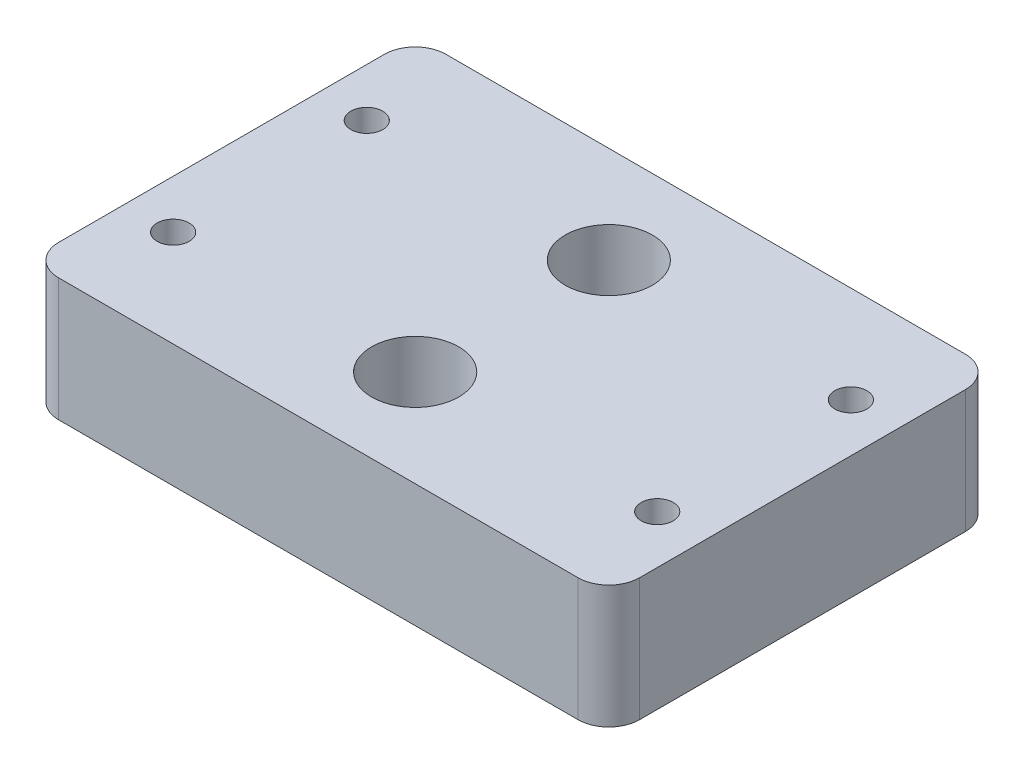
ISO-10303-21;
HEADER;
FILE_DESCRIPTION(('STEP AP214'),'2;1');
FILE_NAME('part.step','',(''),(''),'','','');
FILE_SCHEMA(('AUTOMOTIVE_DESIGN { 1 0 10303 214 1 1 1 1 }'));
ENDSEC;
DATA;
#1=APPLICATION_CONTEXT('core data for automotive mechanical design processes');
#2=APPLICATION_PROTOCOL_DEFINITION('international standard','automotive_design',2000,#1);
#3=PRODUCT_CONTEXT('',#1,'mechanical');
#4=PRODUCT('Part','Part','',(#3));
#5=PRODUCT_RELATED_PRODUCT_CATEGORY('part','',(#4));
#6=PRODUCT_DEFINITION_FORMATION('','',#4);
#7=PRODUCT_DEFINITION_CONTEXT('part definition',#1,'design');
#8=PRODUCT_DEFINITION('design','',#6,#7);
#9=PRODUCT_DEFINITION_SHAPE('','',#8);
#10=(LENGTH_UNIT() NAMED_UNIT(*) SI_UNIT(.MILLI.,.METRE.));
#11=(NAMED_UNIT(*) PLANE_ANGLE_UNIT() SI_UNIT($,.RADIAN.));
#12=(NAMED_UNIT(*) SI_UNIT($,.STERADIAN.) SOLID_ANGLE_UNIT());
#13=UNCERTAINTY_MEASURE_WITH_UNIT(LENGTH_MEASURE(1.E-05),#10,'distance_accuracy_value','');
#14=(GEOMETRIC_REPRESENTATION_CONTEXT(3) GLOBAL_UNCERTAINTY_ASSIGNED_CONTEXT((#13)) GLOBAL_UNIT_ASSIGNED_CONTEXT((#10,
#11,#12)) REPRESENTATION_CONTEXT('',''));
#15=CARTESIAN_POINT('',(0.,0.,0.));
#16=DIRECTION('',(0.,0.,1.));
#17=DIRECTION('',(1.,0.,0.));
#18=AXIS2_PLACEMENT_3D('',#15,#16,#17);
#19=CARTESIAN_POINT('',(60.,12.7,0.));
#20=DIRECTION('',(1.,0.,0.));
#21=DIRECTION('',(0.,0.,-1.));
#22=AXIS2_PLACEMENT_3D('',#19,#20,#21);
#23=PLANE('',#22);
#24=DIRECTION('',(0.,0.,1.));
#25=VECTOR('',#24,1.);
#26=CARTESIAN_POINT('',(60.,12.7,0.));
#27=LINE('',#26,#25);
#28=CARTESIAN_POINT('',(60.,12.7,3.175));
#29=VERTEX_POINT('',#28);
#30=CARTESIAN_POINT('',(60.,12.7,36.825));
#31=VERTEX_POINT('',#30);
#32=EDGE_CURVE('E195',#29,#31,#27,.T.);
#33=ORIENTED_EDGE('',*,*,#32,.T.);
#34=DIRECTION('',(0.,-1.,0.));
#35=VECTOR('',#34,1.);
#36=CARTESIAN_POINT('',(60.,0.,36.825));
#37=LINE('',#36,#35);
#38=CARTESIAN_POINT('',(60.,0.,36.825));
#39=VERTEX_POINT('',#38);
#40=EDGE_CURVE('E182',#31,#39,#37,.T.);
#41=ORIENTED_EDGE('',*,*,#40,.T.);
#42=DIRECTION('',(0.,0.,1.));
#43=VECTOR('',#42,1.);
#44=CARTESIAN_POINT('',(60.,0.,0.));
#45=LINE('',#44,#43);
#46=CARTESIAN_POINT('',(60.,0.,3.175));
#47=VERTEX_POINT('',#46);
#48=EDGE_CURVE('E245',#47,#39,#45,.T.);
#49=ORIENTED_EDGE('',*,*,#48,.F.);
#50=DIRECTION('',(0.,-1.,0.));
#51=VECTOR('',#50,1.);
#52=CARTESIAN_POINT('',(60.,12.7,3.175));
#53=LINE('',#52,#51);
#54=EDGE_CURVE('E179',#47,#29,#53,.F.);
#55=ORIENTED_EDGE('',*,*,#54,.T.);
#56=EDGE_LOOP('',(#33,#41,#49,#55));
#57=FACE_BOUND('',#56,.T.);
#58=ADVANCED_FACE('F46',(#57),#23,.T.);
#59=CARTESIAN_POINT('',(0.,12.7,0.));
#60=DIRECTION('',(0.,0.,-1.));
#61=DIRECTION('',(-1.,0.,0.));
#62=AXIS2_PLACEMENT_3D('',#59,#60,#61);
#63=PLANE('',#62);
#64=DIRECTION('',(1.,0.,0.));
#65=VECTOR('',#64,1.);
#66=CARTESIAN_POINT('',(0.,12.7,0.));
#67=LINE('',#66,#65);
#68=CARTESIAN_POINT('',(3.175,12.7,0.));
#69=VERTEX_POINT('',#68);
#70=CARTESIAN_POINT('',(56.825,12.7,0.));
#71=VERTEX_POINT('',#70);
#72=EDGE_CURVE('E192',#69,#71,#67,.T.);
#73=ORIENTED_EDGE('',*,*,#72,.T.);
#74=DIRECTION('',(0.,-1.,0.));
#75=VECTOR('',#74,1.);
#76=CARTESIAN_POINT('',(56.825,12.7,0.));
#77=LINE('',#76,#75);
#78=CARTESIAN_POINT('',(56.825,0.,0.));
#79=VERTEX_POINT('',#78);
#80=EDGE_CURVE('E11',#71,#79,#77,.T.);
#81=ORIENTED_EDGE('',*,*,#80,.T.);
#82=DIRECTION('',(1.,0.,0.));
#83=VECTOR('',#82,1.);
#84=CARTESIAN_POINT('',(0.,0.,0.));
#85=LINE('',#84,#83);
#86=CARTESIAN_POINT('',(3.175,0.,0.));
#87=VERTEX_POINT('',#86);
#88=EDGE_CURVE('E150',#87,#79,#85,.T.);
#89=ORIENTED_EDGE('',*,*,#88,.F.);
#90=DIRECTION('',(0.,-1.,0.));
#91=VECTOR('',#90,1.);
#92=CARTESIAN_POINT('',(3.175,12.7,0.));
#93=LINE('',#92,#91);
#94=EDGE_CURVE('E55',#87,#69,#93,.F.);
#95=ORIENTED_EDGE('',*,*,#94,.T.);
#96=EDGE_LOOP('',(#73,#81,#89,#95));
#97=FACE_BOUND('',#96,.T.);
#98=ADVANCED_FACE('F250',(#97),#63,.T.);
#99=CARTESIAN_POINT('',(0.,12.7,0.));
#100=DIRECTION('',(1.,0.,0.));
#101=DIRECTION('',(0.,0.,-1.));
#102=AXIS2_PLACEMENT_3D('',#99,#100,#101);
#103=PLANE('',#102);
#104=DIRECTION('',(0.,0.,1.));
#105=VECTOR('',#104,1.);
#106=CARTESIAN_POINT('',(0.,0.,0.));
#107=LINE('',#106,#105);
#108=CARTESIAN_POINT('',(0.,0.,3.175));
#109=VERTEX_POINT('',#108);
#110=CARTESIAN_POINT('',(0.,0.,36.825));
#111=VERTEX_POINT('',#110);
#112=EDGE_CURVE('E143',#109,#111,#107,.T.);
#113=ORIENTED_EDGE('',*,*,#112,.T.);
#114=DIRECTION('',(0.,-1.,0.));
#115=VECTOR('',#114,1.);
#116=CARTESIAN_POINT('',(0.,12.7,36.825));
#117=LINE('',#116,#115);
#118=CARTESIAN_POINT('',(0.,12.7,36.825));
#119=VERTEX_POINT('',#118);
#120=EDGE_CURVE('E118',#111,#119,#117,.F.);
#121=ORIENTED_EDGE('',*,*,#120,.T.);
#122=DIRECTION('',(0.,0.,1.));
#123=VECTOR('',#122,1.);
#124=CARTESIAN_POINT('',(0.,12.7,0.));
#125=LINE('',#124,#123);
#126=CARTESIAN_POINT('',(0.,12.7,3.175));
#127=VERTEX_POINT('',#126);
#128=EDGE_CURVE('E188',#127,#119,#125,.T.);
#129=ORIENTED_EDGE('',*,*,#128,.F.);
#130=DIRECTION('',(0.,-1.,0.));
#131=VECTOR('',#130,1.);
#132=CARTESIAN_POINT('',(0.,0.,3.175));
#133=LINE('',#132,#131);
#134=EDGE_CURVE('E124',#127,#109,#133,.T.);
#135=ORIENTED_EDGE('',*,*,#134,.T.);
#136=EDGE_LOOP('',(#113,#121,#129,#135));
#137=FACE_BOUND('',#136,.T.);
#138=ADVANCED_FACE('F258',(#137),#103,.F.);
#139=CARTESIAN_POINT('',(30.,12.7,30.));
#140=DIRECTION('',(0.,-1.,0.));
#141=DIRECTION('',(0.,0.,-1.));
#142=AXIS2_PLACEMENT_3D('',#139,#140,#141);
#143=CYLINDRICAL_SURFACE('',#142,4.50000000000002);
#144=CARTESIAN_POINT('',(30.,12.7,30.));
#145=DIRECTION('',(0.,1.,0.));
#146=DIRECTION('',(0.,0.,1.));
#147=AXIS2_PLACEMENT_3D('',#144,#145,#146);
#148=CIRCLE('',#147,4.50000000000002);
#149=CARTESIAN_POINT('',(30.,12.7,34.5));
#150=VERTEX_POINT('',#149);
#151=EDGE_CURVE('E199',#150,#150,#148,.T.);
#152=ORIENTED_EDGE('',*,*,#151,.T.);
#153=EDGE_LOOP('',(#152));
#154=FACE_BOUND('',#153,.T.);
#155=CARTESIAN_POINT('',(30.,0.,30.));
#156=DIRECTION('',(0.,1.,0.));
#157=DIRECTION('',(0.,0.,1.));
#158=AXIS2_PLACEMENT_3D('',#155,#156,#157);
#159=CIRCLE('',#158,4.50000000000002);
#160=CARTESIAN_POINT('',(30.,0.,34.5));
#161=VERTEX_POINT('',#160);
#162=EDGE_CURVE('E241',#161,#161,#159,.T.);
#163=ORIENTED_EDGE('',*,*,#162,.F.);
#164=EDGE_LOOP('',(#163));
#165=FACE_BOUND('',#164,.T.);
#166=ADVANCED_FACE('F260',(#154,#165),#143,.F.);
#167=CARTESIAN_POINT('',(30.,12.7,10.));
#168=DIRECTION('',(0.,-1.,0.));
#169=DIRECTION('',(0.,0.,-1.));
#170=AXIS2_PLACEMENT_3D('',#167,#168,#169);
#171=CYLINDRICAL_SURFACE('',#170,4.50000000000007);
#172=CARTESIAN_POINT('',(30.,12.7,10.));
#173=DIRECTION('',(0.,1.,0.));
#174=DIRECTION('',(0.,0.,1.));
#175=AXIS2_PLACEMENT_3D('',#172,#173,#174);
#176=CIRCLE('',#175,4.50000000000007);
#177=CARTESIAN_POINT('',(30.,12.7,14.5000000000001));
#178=VERTEX_POINT('',#177);
#179=EDGE_CURVE('E203',#178,#178,#176,.T.);
#180=ORIENTED_EDGE('',*,*,#179,.T.);
#181=EDGE_LOOP('',(#180));
#182=FACE_BOUND('',#181,.T.);
#183=CARTESIAN_POINT('',(30.,0.,10.));
#184=DIRECTION('',(0.,1.,0.));
#185=DIRECTION('',(0.,0.,1.));
#186=AXIS2_PLACEMENT_3D('',#183,#184,#185);
#187=CIRCLE('',#186,4.50000000000007);
#188=CARTESIAN_POINT('',(30.,0.,14.5000000000001));
#189=VERTEX_POINT('',#188);
#190=EDGE_CURVE('E237',#189,#189,#187,.T.);
#191=ORIENTED_EDGE('',*,*,#190,.F.);
#192=EDGE_LOOP('',(#191));
#193=FACE_BOUND('',#192,.T.);
#194=ADVANCED_FACE('F267',(#182,#193),#171,.F.);
#195=CARTESIAN_POINT('',(5.,12.7,10.));
#196=DIRECTION('',(0.,-1.,0.));
#197=DIRECTION('',(0.,0.,-1.));
#198=AXIS2_PLACEMENT_3D('',#195,#196,#197);
#199=CYLINDRICAL_SURFACE('',#198,1.651);
#200=CARTESIAN_POINT('',(5.,12.7,10.));
#201=DIRECTION('',(0.,1.,0.));
#202=DIRECTION('',(0.,0.,1.));
#203=AXIS2_PLACEMENT_3D('',#200,#201,#202);
#204=CIRCLE('',#203,1.651);
#205=CARTESIAN_POINT('',(5.,12.7,11.651));
#206=VERTEX_POINT('',#205);
#207=EDGE_CURVE('E207',#206,#206,#204,.T.);
#208=ORIENTED_EDGE('',*,*,#207,.T.);
#209=EDGE_LOOP('',(#208));
#210=FACE_BOUND('',#209,.T.);
#211=CARTESIAN_POINT('',(5.,0.,10.));
#212=DIRECTION('',(0.,1.,0.));
#213=DIRECTION('',(0.,0.,1.));
#214=AXIS2_PLACEMENT_3D('',#211,#212,#213);
#215=CIRCLE('',#214,1.651);
#216=CARTESIAN_POINT('',(5.,0.,11.651));
#217=VERTEX_POINT('',#216);
#218=EDGE_CURVE('E233',#217,#217,#215,.T.);
#219=ORIENTED_EDGE('',*,*,#218,.F.);
#220=EDGE_LOOP('',(#219));
#221=FACE_BOUND('',#220,.T.);
#222=ADVANCED_FACE('F281',(#210,#221),#199,.F.);
#223=CARTESIAN_POINT('',(55.,12.7,10.));
#224=DIRECTION('',(0.,-1.,0.));
#225=DIRECTION('',(0.,0.,-1.));
#226=AXIS2_PLACEMENT_3D('',#223,#224,#225);
#227=CYLINDRICAL_SURFACE('',#226,1.651);
#228=CARTESIAN_POINT('',(55.,12.7,10.));
#229=DIRECTION('',(0.,1.,0.));
#230=DIRECTION('',(0.,0.,1.));
#231=AXIS2_PLACEMENT_3D('',#228,#229,#230);
#232=CIRCLE('',#231,1.651);
#233=CARTESIAN_POINT('',(55.,12.7,11.651));
#234=VERTEX_POINT('',#233);
#235=EDGE_CURVE('E211',#234,#234,#232,.T.);
#236=ORIENTED_EDGE('',*,*,#235,.T.);
#237=EDGE_LOOP('',(#236));
#238=FACE_BOUND('',#237,.T.);
#239=CARTESIAN_POINT('',(55.,0.,10.));
#240=DIRECTION('',(0.,1.,0.));
#241=DIRECTION('',(0.,0.,1.));
#242=AXIS2_PLACEMENT_3D('',#239,#240,#241);
#243=CIRCLE('',#242,1.651);
#244=CARTESIAN_POINT('',(55.,0.,11.651));
#245=VERTEX_POINT('',#244);
#246=EDGE_CURVE('E229',#245,#245,#243,.T.);
#247=ORIENTED_EDGE('',*,*,#246,.F.);
#248=EDGE_LOOP('',(#247));
#249=FACE_BOUND('',#248,.T.);
#250=ADVANCED_FACE('F285',(#238,#249),#227,.F.);
#251=CARTESIAN_POINT('',(5.,12.7,30.));
#252=DIRECTION('',(0.,-1.,0.));
#253=DIRECTION('',(0.,0.,-1.));
#254=AXIS2_PLACEMENT_3D('',#251,#252,#253);
#255=CYLINDRICAL_SURFACE('',#254,1.651);
#256=CARTESIAN_POINT('',(5.,12.7,30.));
#257=DIRECTION('',(0.,1.,0.));
#258=DIRECTION('',(0.,0.,1.));
#259=AXIS2_PLACEMENT_3D('',#256,#257,#258);
#260=CIRCLE('',#259,1.651);
#261=CARTESIAN_POINT('',(5.,12.7,31.651));
#262=VERTEX_POINT('',#261);
#263=EDGE_CURVE('E148',#262,#262,#260,.T.);
#264=ORIENTED_EDGE('',*,*,#263,.T.);
#265=EDGE_LOOP('',(#264));
#266=FACE_BOUND('',#265,.T.);
#267=CARTESIAN_POINT('',(5.,0.,30.));
#268=DIRECTION('',(0.,1.,0.));
#269=DIRECTION('',(0.,0.,1.));
#270=AXIS2_PLACEMENT_3D('',#267,#268,#269);
#271=CIRCLE('',#270,1.651);
#272=CARTESIAN_POINT('',(5.,0.,31.651));
#273=VERTEX_POINT('',#272);
#274=EDGE_CURVE('E225',#273,#273,#271,.T.);
#275=ORIENTED_EDGE('',*,*,#274,.F.);
#276=EDGE_LOOP('',(#275));
#277=FACE_BOUND('',#276,.T.);
#278=ADVANCED_FACE('F289',(#266,#277),#255,.F.);
#279=CARTESIAN_POINT('',(55.,12.7,30.));
#280=DIRECTION('',(0.,-1.,0.));
#281=DIRECTION('',(0.,0.,-1.));
#282=AXIS2_PLACEMENT_3D('',#279,#280,#281);
#283=CYLINDRICAL_SURFACE('',#282,1.651);
#284=CARTESIAN_POINT('',(55.,12.7,30.));
#285=DIRECTION('',(0.,1.,0.));
#286=DIRECTION('',(0.,0.,1.));
#287=AXIS2_PLACEMENT_3D('',#284,#285,#286);
#288=CIRCLE('',#287,1.651);
#289=CARTESIAN_POINT('',(55.,12.7,31.651));
#290=VERTEX_POINT('',#289);
#291=EDGE_CURVE('E142',#290,#290,#288,.T.);
#292=ORIENTED_EDGE('',*,*,#291,.T.);
#293=EDGE_LOOP('',(#292));
#294=FACE_BOUND('',#293,.T.);
#295=CARTESIAN_POINT('',(55.,0.,30.));
#296=DIRECTION('',(0.,1.,0.));
#297=DIRECTION('',(0.,0.,1.));
#298=AXIS2_PLACEMENT_3D('',#295,#296,#297);
#299=CIRCLE('',#298,1.651);
#300=CARTESIAN_POINT('',(55.,0.,31.651));
#301=VERTEX_POINT('',#300);
#302=EDGE_CURVE('E221',#301,#301,#299,.T.);
#303=ORIENTED_EDGE('',*,*,#302,.F.);
#304=EDGE_LOOP('',(#303));
#305=FACE_BOUND('',#304,.T.);
#306=ADVANCED_FACE('F293',(#294,#305),#283,.F.);
#307=CARTESIAN_POINT('',(0.,12.7,40.));
#308=DIRECTION('',(0.,0.,-1.));
#309=DIRECTION('',(-1.,0.,0.));
#310=AXIS2_PLACEMENT_3D('',#307,#308,#309);
#311=PLANE('',#310);
#312=DIRECTION('',(1.,0.,0.));
#313=VECTOR('',#312,1.);
#314=CARTESIAN_POINT('',(0.,12.7,40.));
#315=LINE('',#314,#313);
#316=CARTESIAN_POINT('',(3.175,12.7,40.));
#317=VERTEX_POINT('',#316);
#318=CARTESIAN_POINT('',(56.825,12.7,40.));
#319=VERTEX_POINT('',#318);
#320=EDGE_CURVE('E134',#317,#319,#315,.T.);
#321=ORIENTED_EDGE('',*,*,#320,.F.);
#322=DIRECTION('',(0.,-1.,0.));
#323=VECTOR('',#322,1.);
#324=CARTESIAN_POINT('',(3.175,12.7,40.));
#325=LINE('',#324,#323);
#326=CARTESIAN_POINT('',(3.175,0.,40.));
#327=VERTEX_POINT('',#326);
#328=EDGE_CURVE('E117',#317,#327,#325,.T.);
#329=ORIENTED_EDGE('',*,*,#328,.T.);
#330=DIRECTION('',(1.,0.,0.));
#331=VECTOR('',#330,1.);
#332=CARTESIAN_POINT('',(0.,0.,40.));
#333=LINE('',#332,#331);
#334=CARTESIAN_POINT('',(56.825,0.,40.));
#335=VERTEX_POINT('',#334);
#336=EDGE_CURVE('E131',#327,#335,#333,.T.);
#337=ORIENTED_EDGE('',*,*,#336,.T.);
#338=DIRECTION('',(0.,-1.,0.));
#339=VECTOR('',#338,1.);
#340=CARTESIAN_POINT('',(56.825,12.7,40.));
#341=LINE('',#340,#339);
#342=EDGE_CURVE('E137',#335,#319,#341,.F.);
#343=ORIENTED_EDGE('',*,*,#342,.T.);
#344=EDGE_LOOP('',(#321,#329,#337,#343));
#345=FACE_BOUND('',#344,.T.);
#346=ADVANCED_FACE('F130',(#345),#311,.F.);
#347=CARTESIAN_POINT('',(0.,12.7,0.));
#348=DIRECTION('',(0.,1.,0.));
#349=DIRECTION('',(0.,0.,1.));
#350=AXIS2_PLACEMENT_3D('',#347,#348,#349);
#351=PLANE('',#350);
#352=ORIENTED_EDGE('',*,*,#291,.F.);
#353=EDGE_LOOP('',(#352));
#354=FACE_BOUND('',#353,.T.);
#355=ORIENTED_EDGE('',*,*,#263,.F.);
#356=EDGE_LOOP('',(#355));
#357=FACE_BOUND('',#356,.T.);
#358=ORIENTED_EDGE('',*,*,#235,.F.);
#359=EDGE_LOOP('',(#358));
#360=FACE_BOUND('',#359,.T.);
#361=ORIENTED_EDGE('',*,*,#207,.F.);
#362=EDGE_LOOP('',(#361));
#363=FACE_BOUND('',#362,.T.);
#364=ORIENTED_EDGE('',*,*,#179,.F.);
#365=EDGE_LOOP('',(#364));
#366=FACE_BOUND('',#365,.T.);
#367=ORIENTED_EDGE('',*,*,#151,.F.);
#368=EDGE_LOOP('',(#367));
#369=FACE_BOUND('',#368,.T.);
#370=ORIENTED_EDGE('',*,*,#128,.T.);
#371=CARTESIAN_POINT('',(3.175,12.7,36.825));
#372=DIRECTION('',(0.,1.,0.));
#373=DIRECTION('',(0.,0.,1.));
#374=AXIS2_PLACEMENT_3D('',#371,#372,#373);
#375=CIRCLE('',#374,3.175);
#376=EDGE_CURVE('E176',#119,#317,#375,.T.);
#377=ORIENTED_EDGE('',*,*,#376,.T.);
#378=ORIENTED_EDGE('',*,*,#320,.T.);
#379=CARTESIAN_POINT('',(56.825,12.7,36.825));
#380=DIRECTION('',(0.,1.,0.));
#381=DIRECTION('',(0.,0.,1.));
#382=AXIS2_PLACEMENT_3D('',#379,#380,#381);
#383=CIRCLE('',#382,3.175);
#384=EDGE_CURVE('E173',#319,#31,#383,.T.);
#385=ORIENTED_EDGE('',*,*,#384,.T.);
#386=ORIENTED_EDGE('',*,*,#32,.F.);
#387=CARTESIAN_POINT('',(56.825,12.7,3.175));
#388=DIRECTION('',(0.,1.,0.));
#389=DIRECTION('',(0.,0.,1.));
#390=AXIS2_PLACEMENT_3D('',#387,#388,#389);
#391=CIRCLE('',#390,3.175);
#392=EDGE_CURVE('E62',#29,#71,#391,.T.);
#393=ORIENTED_EDGE('',*,*,#392,.T.);
#394=ORIENTED_EDGE('',*,*,#72,.F.);
#395=CARTESIAN_POINT('',(3.175,12.7,3.175));
#396=DIRECTION('',(0.,1.,0.));
#397=DIRECTION('',(0.,0.,1.));
#398=AXIS2_PLACEMENT_3D('',#395,#396,#397);
#399=CIRCLE('',#398,3.175);
#400=EDGE_CURVE('E168',#69,#127,#399,.T.);
#401=ORIENTED_EDGE('',*,*,#400,.T.);
#402=EDGE_LOOP('',(#370,#377,#378,#385,#386,#393,#394,#401));
#403=FACE_BOUND('',#402,.T.);
#404=ADVANCED_FACE('F256',(#354,#357,#360,#363,#366,#369,#403),#351,.T.);
#405=CARTESIAN_POINT('',(0.,0.,0.));
#406=DIRECTION('',(0.,1.,0.));
#407=DIRECTION('',(0.,0.,1.));
#408=AXIS2_PLACEMENT_3D('',#405,#406,#407);
#409=PLANE('',#408);
#410=ORIENTED_EDGE('',*,*,#302,.T.);
#411=EDGE_LOOP('',(#410));
#412=FACE_BOUND('',#411,.T.);
#413=ORIENTED_EDGE('',*,*,#274,.T.);
#414=EDGE_LOOP('',(#413));
#415=FACE_BOUND('',#414,.T.);
#416=ORIENTED_EDGE('',*,*,#246,.T.);
#417=EDGE_LOOP('',(#416));
#418=FACE_BOUND('',#417,.T.);
#419=ORIENTED_EDGE('',*,*,#218,.T.);
#420=EDGE_LOOP('',(#419));
#421=FACE_BOUND('',#420,.T.);
#422=ORIENTED_EDGE('',*,*,#190,.T.);
#423=EDGE_LOOP('',(#422));
#424=FACE_BOUND('',#423,.T.);
#425=ORIENTED_EDGE('',*,*,#162,.T.);
#426=EDGE_LOOP('',(#425));
#427=FACE_BOUND('',#426,.T.);
#428=ORIENTED_EDGE('',*,*,#336,.F.);
#429=CARTESIAN_POINT('',(3.175,0.,36.825));
#430=DIRECTION('',(0.,1.,0.));
#431=DIRECTION('',(0.,0.,1.));
#432=AXIS2_PLACEMENT_3D('',#429,#430,#431);
#433=CIRCLE('',#432,3.175);
#434=EDGE_CURVE('E113',#327,#111,#433,.F.);
#435=ORIENTED_EDGE('',*,*,#434,.T.);
#436=ORIENTED_EDGE('',*,*,#112,.F.);
#437=CARTESIAN_POINT('',(3.175,0.,3.175));
#438=DIRECTION('',(0.,1.,0.));
#439=DIRECTION('',(0.,0.,1.));
#440=AXIS2_PLACEMENT_3D('',#437,#438,#439);
#441=CIRCLE('',#440,3.175);
#442=EDGE_CURVE('E136',#109,#87,#441,.F.);
#443=ORIENTED_EDGE('',*,*,#442,.T.);
#444=ORIENTED_EDGE('',*,*,#88,.T.);
#445=CARTESIAN_POINT('',(56.825,0.,3.175));
#446=DIRECTION('',(0.,1.,0.));
#447=DIRECTION('',(0.,0.,1.));
#448=AXIS2_PLACEMENT_3D('',#445,#446,#447);
#449=CIRCLE('',#448,3.175);
#450=EDGE_CURVE('E158',#79,#47,#449,.F.);
#451=ORIENTED_EDGE('',*,*,#450,.T.);
#452=ORIENTED_EDGE('',*,*,#48,.T.);
#453=CARTESIAN_POINT('',(56.825,0.,36.825));
#454=DIRECTION('',(0.,1.,0.));
#455=DIRECTION('',(0.,0.,1.));
#456=AXIS2_PLACEMENT_3D('',#453,#454,#455);
#457=CIRCLE('',#456,3.175);
#458=EDGE_CURVE('E125',#39,#335,#457,.F.);
#459=ORIENTED_EDGE('',*,*,#458,.T.);
#460=EDGE_LOOP('',(#428,#435,#436,#443,#444,#451,#452,#459));
#461=FACE_BOUND('',#460,.T.);
#462=ADVANCED_FACE('F139',(#412,#415,#418,#421,#424,#427,#461),#409,.F.);
#463=CARTESIAN_POINT('',(3.175,12.7,36.825));
#464=DIRECTION('',(0.,-1.,0.));
#465=DIRECTION('',(0.,0.,-1.));
#466=AXIS2_PLACEMENT_3D('',#463,#464,#465);
#467=CYLINDRICAL_SURFACE('',#466,3.175);
#468=ORIENTED_EDGE('',*,*,#376,.F.);
#469=ORIENTED_EDGE('',*,*,#120,.F.);
#470=ORIENTED_EDGE('',*,*,#434,.F.);
#471=ORIENTED_EDGE('',*,*,#328,.F.);
#472=EDGE_LOOP('',(#468,#469,#470,#471));
#473=FACE_BOUND('',#472,.T.);
#474=ADVANCED_FACE('F116',(#473),#467,.T.);
#475=CARTESIAN_POINT('',(56.825,12.7,36.825));
#476=DIRECTION('',(0.,1.,0.));
#477=DIRECTION('',(0.,0.,1.));
#478=AXIS2_PLACEMENT_3D('',#475,#476,#477);
#479=CYLINDRICAL_SURFACE('',#478,3.175);
#480=ORIENTED_EDGE('',*,*,#384,.F.);
#481=ORIENTED_EDGE('',*,*,#342,.F.);
#482=ORIENTED_EDGE('',*,*,#458,.F.);
#483=ORIENTED_EDGE('',*,*,#40,.F.);
#484=EDGE_LOOP('',(#480,#481,#482,#483));
#485=FACE_BOUND('',#484,.T.);
#486=ADVANCED_FACE('F299',(#485),#479,.T.);
#487=CARTESIAN_POINT('',(56.825,12.7,3.175));
#488=DIRECTION('',(0.,-1.,0.));
#489=DIRECTION('',(0.,0.,-1.));
#490=AXIS2_PLACEMENT_3D('',#487,#488,#489);
#491=CYLINDRICAL_SURFACE('',#490,3.175);
#492=ORIENTED_EDGE('',*,*,#392,.F.);
#493=ORIENTED_EDGE('',*,*,#54,.F.);
#494=ORIENTED_EDGE('',*,*,#450,.F.);
#495=ORIENTED_EDGE('',*,*,#80,.F.);
#496=EDGE_LOOP('',(#492,#493,#494,#495));
#497=FACE_BOUND('',#496,.T.);
#498=ADVANCED_FACE('F301',(#497),#491,.T.);
#499=CARTESIAN_POINT('',(3.175,12.7,3.175));
#500=DIRECTION('',(0.,1.,0.));
#501=DIRECTION('',(0.,0.,1.));
#502=AXIS2_PLACEMENT_3D('',#499,#500,#501);
#503=CYLINDRICAL_SURFACE('',#502,3.175);
#504=ORIENTED_EDGE('',*,*,#400,.F.);
#505=ORIENTED_EDGE('',*,*,#94,.F.);
#506=ORIENTED_EDGE('',*,*,#442,.F.);
#507=ORIENTED_EDGE('',*,*,#134,.F.);
#508=EDGE_LOOP('',(#504,#505,#506,#507));
#509=FACE_BOUND('',#508,.T.);
#510=ADVANCED_FACE('F48',(#509),#503,.T.);
#511=CLOSED_SHELL('',(#58,#98,#138,#166,#194,#222,#250,#278,#306,#346,#404,#462,#474,#486,#498,#510));
#512=MANIFOLD_SOLID_BREP('B2',#511);
#513=ADVANCED_BREP_SHAPE_REPRESENTATION('',(#18,#512),#14);
#514=SHAPE_DEFINITION_REPRESENTATION(#9,#513);
ENDSEC;
END-ISO-10303-21;
